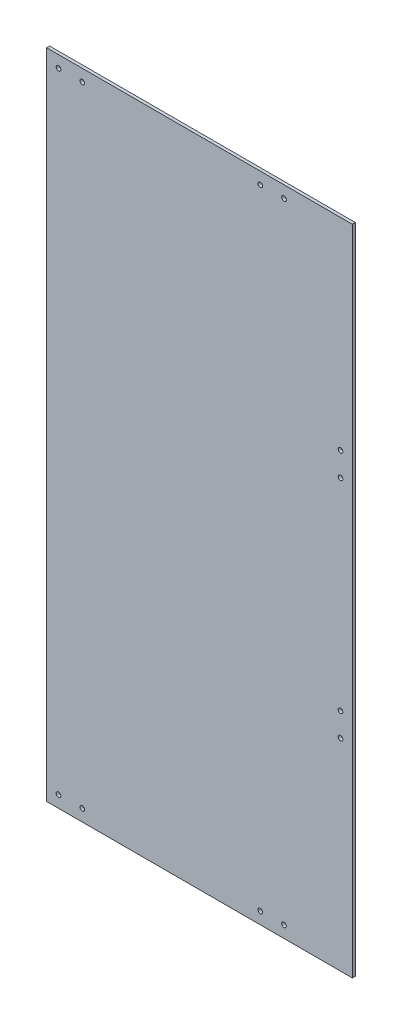
ISO-10303-21;
HEADER;
FILE_DESCRIPTION(('STEP AP214'),'2;1');
FILE_NAME('part.step','',(''),(''),'','','');
FILE_SCHEMA(('AUTOMOTIVE_DESIGN { 1 0 10303 214 1 1 1 1 }'));
ENDSEC;
DATA;
#1=APPLICATION_CONTEXT('core data for automotive mechanical design processes');
#2=APPLICATION_PROTOCOL_DEFINITION('international standard','automotive_design',2000,#1);
#3=PRODUCT_CONTEXT('',#1,'mechanical');
#4=PRODUCT('Part','Part','',(#3));
#5=PRODUCT_RELATED_PRODUCT_CATEGORY('part','',(#4));
#6=PRODUCT_DEFINITION_FORMATION('','',#4);
#7=PRODUCT_DEFINITION_CONTEXT('part definition',#1,'design');
#8=PRODUCT_DEFINITION('design','',#6,#7);
#9=PRODUCT_DEFINITION_SHAPE('','',#8);
#10=(LENGTH_UNIT() NAMED_UNIT(*) SI_UNIT(.MILLI.,.METRE.));
#11=(NAMED_UNIT(*) PLANE_ANGLE_UNIT() SI_UNIT($,.RADIAN.));
#12=(NAMED_UNIT(*) SI_UNIT($,.STERADIAN.) SOLID_ANGLE_UNIT());
#13=UNCERTAINTY_MEASURE_WITH_UNIT(LENGTH_MEASURE(1.E-05),#10,'distance_accuracy_value','');
#14=(GEOMETRIC_REPRESENTATION_CONTEXT(3) GLOBAL_UNCERTAINTY_ASSIGNED_CONTEXT((#13)) GLOBAL_UNIT_ASSIGNED_CONTEXT((#10,
#11,#12)) REPRESENTATION_CONTEXT('',''));
#15=CARTESIAN_POINT('',(0.,0.,0.));
#16=DIRECTION('',(0.,0.,1.));
#17=DIRECTION('',(1.,0.,0.));
#18=AXIS2_PLACEMENT_3D('',#15,#16,#17);
#19=CARTESIAN_POINT('',(0.,0.,0.));
#20=DIRECTION('',(0.,0.,-1.));
#21=DIRECTION('',(-1.,0.,0.));
#22=AXIS2_PLACEMENT_3D('',#19,#20,#21);
#23=PLANE('',#22);
#24=CARTESIAN_POINT('',(150.876,-107.95,0.));
#25=DIRECTION('',(0.,0.,1.));
#26=DIRECTION('',(1.,0.,0.));
#27=AXIS2_PLACEMENT_3D('',#24,#25,#26);
#28=CIRCLE('',#27,2.4892);
#29=CARTESIAN_POINT('',(153.3652,-107.95,0.));
#30=VERTEX_POINT('',#29);
#31=EDGE_CURVE('E143',#30,#30,#28,.T.);
#32=ORIENTED_EDGE('',*,*,#31,.T.);
#33=EDGE_LOOP('',(#32));
#34=FACE_BOUND('',#33,.T.);
#35=CARTESIAN_POINT('',(150.876,-133.35,0.));
#36=DIRECTION('',(0.,0.,1.));
#37=DIRECTION('',(1.,0.,0.));
#38=AXIS2_PLACEMENT_3D('',#35,#36,#37);
#39=CIRCLE('',#38,2.4892);
#40=CARTESIAN_POINT('',(153.3652,-133.35,0.));
#41=VERTEX_POINT('',#40);
#42=EDGE_CURVE('E119',#41,#41,#39,.T.);
#43=ORIENTED_EDGE('',*,*,#42,.T.);
#44=EDGE_LOOP('',(#43));
#45=FACE_BOUND('',#44,.T.);
#46=DIRECTION('',(-1.,0.,0.));
#47=VECTOR('',#46,1.);
#48=CARTESIAN_POINT('',(163.576,349.25,0.));
#49=LINE('',#48,#47);
#50=CARTESIAN_POINT('',(163.576,349.25,0.));
#51=VERTEX_POINT('',#50);
#52=CARTESIAN_POINT('',(-163.576,349.25,0.));
#53=VERTEX_POINT('',#52);
#54=EDGE_CURVE('E115',#51,#53,#49,.T.);
#55=ORIENTED_EDGE('',*,*,#54,.F.);
#56=DIRECTION('',(0.,1.,0.));
#57=VECTOR('',#56,1.);
#58=CARTESIAN_POINT('',(163.576,-349.25,0.));
#59=LINE('',#58,#57);
#60=CARTESIAN_POINT('',(163.576,-349.25,0.));
#61=VERTEX_POINT('',#60);
#62=EDGE_CURVE('E86',#61,#51,#59,.T.);
#63=ORIENTED_EDGE('',*,*,#62,.F.);
#64=DIRECTION('',(1.,0.,0.));
#65=VECTOR('',#64,1.);
#66=CARTESIAN_POINT('',(163.576,-349.25,0.));
#67=LINE('',#66,#65);
#68=CARTESIAN_POINT('',(-163.576,-349.25,0.));
#69=VERTEX_POINT('',#68);
#70=EDGE_CURVE('E80',#69,#61,#67,.T.);
#71=ORIENTED_EDGE('',*,*,#70,.F.);
#72=DIRECTION('',(0.,-1.,0.));
#73=VECTOR('',#72,1.);
#74=CARTESIAN_POINT('',(-163.576,-349.25,0.));
#75=LINE('',#74,#73);
#76=EDGE_CURVE('E104',#53,#69,#75,.T.);
#77=ORIENTED_EDGE('',*,*,#76,.F.);
#78=EDGE_LOOP('',(#55,#63,#71,#77));
#79=FACE_BOUND('',#78,.T.);
#80=CARTESIAN_POINT('',(150.876,107.95,0.));
#81=DIRECTION('',(0.,0.,1.));
#82=DIRECTION('',(1.,0.,0.));
#83=AXIS2_PLACEMENT_3D('',#80,#81,#82);
#84=CIRCLE('',#83,2.4892);
#85=CARTESIAN_POINT('',(153.3652,107.95,0.));
#86=VERTEX_POINT('',#85);
#87=EDGE_CURVE('E151',#86,#86,#84,.T.);
#88=ORIENTED_EDGE('',*,*,#87,.T.);
#89=EDGE_LOOP('',(#88));
#90=FACE_BOUND('',#89,.T.);
#91=CARTESIAN_POINT('',(150.876,133.35,0.));
#92=DIRECTION('',(0.,0.,1.));
#93=DIRECTION('',(1.,0.,0.));
#94=AXIS2_PLACEMENT_3D('',#91,#92,#93);
#95=CIRCLE('',#94,2.4892);
#96=CARTESIAN_POINT('',(153.3652,133.35,0.));
#97=VERTEX_POINT('',#96);
#98=EDGE_CURVE('E159',#97,#97,#95,.T.);
#99=ORIENTED_EDGE('',*,*,#98,.T.);
#100=EDGE_LOOP('',(#99));
#101=FACE_BOUND('',#100,.T.);
#102=CARTESIAN_POINT('',(-150.876,-336.55,0.));
#103=DIRECTION('',(0.,0.,1.));
#104=DIRECTION('',(1.,0.,0.));
#105=AXIS2_PLACEMENT_3D('',#102,#103,#104);
#106=CIRCLE('',#105,2.4892);
#107=CARTESIAN_POINT('',(-148.3868,-336.55,0.));
#108=VERTEX_POINT('',#107);
#109=EDGE_CURVE('E167',#108,#108,#106,.T.);
#110=ORIENTED_EDGE('',*,*,#109,.T.);
#111=EDGE_LOOP('',(#110));
#112=FACE_BOUND('',#111,.T.);
#113=CARTESIAN_POINT('',(-125.476,-336.55,0.));
#114=DIRECTION('',(0.,0.,1.));
#115=DIRECTION('',(1.,0.,0.));
#116=AXIS2_PLACEMENT_3D('',#113,#114,#115);
#117=CIRCLE('',#116,2.4892);
#118=CARTESIAN_POINT('',(-122.9868,-336.55,0.));
#119=VERTEX_POINT('',#118);
#120=EDGE_CURVE('E175',#119,#119,#117,.T.);
#121=ORIENTED_EDGE('',*,*,#120,.T.);
#122=EDGE_LOOP('',(#121));
#123=FACE_BOUND('',#122,.T.);
#124=CARTESIAN_POINT('',(65.024,-336.55,0.));
#125=DIRECTION('',(0.,0.,1.));
#126=DIRECTION('',(1.,0.,0.));
#127=AXIS2_PLACEMENT_3D('',#124,#125,#126);
#128=CIRCLE('',#127,2.4892);
#129=CARTESIAN_POINT('',(67.5132,-336.55,0.));
#130=VERTEX_POINT('',#129);
#131=EDGE_CURVE('E183',#130,#130,#128,.T.);
#132=ORIENTED_EDGE('',*,*,#131,.T.);
#133=EDGE_LOOP('',(#132));
#134=FACE_BOUND('',#133,.T.);
#135=CARTESIAN_POINT('',(90.424,-336.55,0.));
#136=DIRECTION('',(0.,0.,1.));
#137=DIRECTION('',(1.,0.,0.));
#138=AXIS2_PLACEMENT_3D('',#135,#136,#137);
#139=CIRCLE('',#138,2.4892);
#140=CARTESIAN_POINT('',(92.9132,-336.55,0.));
#141=VERTEX_POINT('',#140);
#142=EDGE_CURVE('E191',#141,#141,#139,.T.);
#143=ORIENTED_EDGE('',*,*,#142,.T.);
#144=EDGE_LOOP('',(#143));
#145=FACE_BOUND('',#144,.T.);
#146=CARTESIAN_POINT('',(90.424,336.55,0.));
#147=DIRECTION('',(0.,0.,1.));
#148=DIRECTION('',(1.,0.,0.));
#149=AXIS2_PLACEMENT_3D('',#146,#147,#148);
#150=CIRCLE('',#149,2.4892);
#151=CARTESIAN_POINT('',(92.9132,336.55,0.));
#152=VERTEX_POINT('',#151);
#153=EDGE_CURVE('E199',#152,#152,#150,.T.);
#154=ORIENTED_EDGE('',*,*,#153,.T.);
#155=EDGE_LOOP('',(#154));
#156=FACE_BOUND('',#155,.T.);
#157=CARTESIAN_POINT('',(65.024,336.55,0.));
#158=DIRECTION('',(0.,0.,1.));
#159=DIRECTION('',(1.,0.,0.));
#160=AXIS2_PLACEMENT_3D('',#157,#158,#159);
#161=CIRCLE('',#160,2.4892);
#162=CARTESIAN_POINT('',(67.5132,336.55,0.));
#163=VERTEX_POINT('',#162);
#164=EDGE_CURVE('E207',#163,#163,#161,.T.);
#165=ORIENTED_EDGE('',*,*,#164,.T.);
#166=EDGE_LOOP('',(#165));
#167=FACE_BOUND('',#166,.T.);
#168=CARTESIAN_POINT('',(-125.476,336.55,0.));
#169=DIRECTION('',(0.,0.,1.));
#170=DIRECTION('',(1.,0.,0.));
#171=AXIS2_PLACEMENT_3D('',#168,#169,#170);
#172=CIRCLE('',#171,2.4892);
#173=CARTESIAN_POINT('',(-122.9868,336.55,0.));
#174=VERTEX_POINT('',#173);
#175=EDGE_CURVE('E215',#174,#174,#172,.T.);
#176=ORIENTED_EDGE('',*,*,#175,.T.);
#177=EDGE_LOOP('',(#176));
#178=FACE_BOUND('',#177,.T.);
#179=CARTESIAN_POINT('',(-150.876,336.55,0.));
#180=DIRECTION('',(0.,0.,1.));
#181=DIRECTION('',(1.,0.,0.));
#182=AXIS2_PLACEMENT_3D('',#179,#180,#181);
#183=CIRCLE('',#182,2.4892);
#184=CARTESIAN_POINT('',(-148.3868,336.55,0.));
#185=VERTEX_POINT('',#184);
#186=EDGE_CURVE('E223',#185,#185,#183,.T.);
#187=ORIENTED_EDGE('',*,*,#186,.T.);
#188=EDGE_LOOP('',(#187));
#189=FACE_BOUND('',#188,.T.);
#190=ADVANCED_FACE('F45',(#34,#45,#79,#90,#101,#112,#123,#134,#145,#156,#167,#178,#189),#23,.T.);
#191=CARTESIAN_POINT('',(0.,0.,3.175));
#192=DIRECTION('',(0.,0.,-1.));
#193=DIRECTION('',(-1.,0.,0.));
#194=AXIS2_PLACEMENT_3D('',#191,#192,#193);
#195=PLANE('',#194);
#196=CARTESIAN_POINT('',(-150.876,336.55,3.175));
#197=DIRECTION('',(0.,0.,1.));
#198=DIRECTION('',(1.,0.,0.));
#199=AXIS2_PLACEMENT_3D('',#196,#197,#198);
#200=CIRCLE('',#199,2.4892);
#201=CARTESIAN_POINT('',(-148.3868,336.55,3.175));
#202=VERTEX_POINT('',#201);
#203=EDGE_CURVE('E227',#202,#202,#200,.T.);
#204=ORIENTED_EDGE('',*,*,#203,.F.);
#205=EDGE_LOOP('',(#204));
#206=FACE_BOUND('',#205,.T.);
#207=CARTESIAN_POINT('',(-125.476,336.55,3.175));
#208=DIRECTION('',(0.,0.,1.));
#209=DIRECTION('',(1.,0.,0.));
#210=AXIS2_PLACEMENT_3D('',#207,#208,#209);
#211=CIRCLE('',#210,2.48919999999998);
#212=CARTESIAN_POINT('',(-122.9868,336.55,3.175));
#213=VERTEX_POINT('',#212);
#214=EDGE_CURVE('E219',#213,#213,#211,.T.);
#215=ORIENTED_EDGE('',*,*,#214,.F.);
#216=EDGE_LOOP('',(#215));
#217=FACE_BOUND('',#216,.T.);
#218=CARTESIAN_POINT('',(65.024,336.55,3.175));
#219=DIRECTION('',(0.,0.,1.));
#220=DIRECTION('',(1.,0.,0.));
#221=AXIS2_PLACEMENT_3D('',#218,#219,#220);
#222=CIRCLE('',#221,2.48919999999998);
#223=CARTESIAN_POINT('',(67.5132,336.55,3.175));
#224=VERTEX_POINT('',#223);
#225=EDGE_CURVE('E211',#224,#224,#222,.T.);
#226=ORIENTED_EDGE('',*,*,#225,.F.);
#227=EDGE_LOOP('',(#226));
#228=FACE_BOUND('',#227,.T.);
#229=CARTESIAN_POINT('',(90.424,336.55,3.175));
#230=DIRECTION('',(0.,0.,1.));
#231=DIRECTION('',(1.,0.,0.));
#232=AXIS2_PLACEMENT_3D('',#229,#230,#231);
#233=CIRCLE('',#232,2.48919999999998);
#234=CARTESIAN_POINT('',(92.9132,336.55,3.175));
#235=VERTEX_POINT('',#234);
#236=EDGE_CURVE('E203',#235,#235,#233,.T.);
#237=ORIENTED_EDGE('',*,*,#236,.F.);
#238=EDGE_LOOP('',(#237));
#239=FACE_BOUND('',#238,.T.);
#240=CARTESIAN_POINT('',(90.424,-336.55,3.175));
#241=DIRECTION('',(0.,0.,1.));
#242=DIRECTION('',(1.,0.,0.));
#243=AXIS2_PLACEMENT_3D('',#240,#241,#242);
#244=CIRCLE('',#243,2.48919999999998);
#245=CARTESIAN_POINT('',(92.9132,-336.55,3.175));
#246=VERTEX_POINT('',#245);
#247=EDGE_CURVE('E195',#246,#246,#244,.T.);
#248=ORIENTED_EDGE('',*,*,#247,.F.);
#249=EDGE_LOOP('',(#248));
#250=FACE_BOUND('',#249,.T.);
#251=CARTESIAN_POINT('',(65.024,-336.55,3.175));
#252=DIRECTION('',(0.,0.,1.));
#253=DIRECTION('',(1.,0.,0.));
#254=AXIS2_PLACEMENT_3D('',#251,#252,#253);
#255=CIRCLE('',#254,2.48919999999998);
#256=CARTESIAN_POINT('',(67.5132,-336.55,3.175));
#257=VERTEX_POINT('',#256);
#258=EDGE_CURVE('E187',#257,#257,#255,.T.);
#259=ORIENTED_EDGE('',*,*,#258,.F.);
#260=EDGE_LOOP('',(#259));
#261=FACE_BOUND('',#260,.T.);
#262=CARTESIAN_POINT('',(-125.476,-336.55,3.175));
#263=DIRECTION('',(0.,0.,1.));
#264=DIRECTION('',(1.,0.,0.));
#265=AXIS2_PLACEMENT_3D('',#262,#263,#264);
#266=CIRCLE('',#265,2.48919999999998);
#267=CARTESIAN_POINT('',(-122.9868,-336.55,3.175));
#268=VERTEX_POINT('',#267);
#269=EDGE_CURVE('E179',#268,#268,#266,.T.);
#270=ORIENTED_EDGE('',*,*,#269,.F.);
#271=EDGE_LOOP('',(#270));
#272=FACE_BOUND('',#271,.T.);
#273=CARTESIAN_POINT('',(-150.876,-336.55,3.175));
#274=DIRECTION('',(0.,0.,1.));
#275=DIRECTION('',(1.,0.,0.));
#276=AXIS2_PLACEMENT_3D('',#273,#274,#275);
#277=CIRCLE('',#276,2.4892);
#278=CARTESIAN_POINT('',(-148.3868,-336.55,3.175));
#279=VERTEX_POINT('',#278);
#280=EDGE_CURVE('E171',#279,#279,#277,.T.);
#281=ORIENTED_EDGE('',*,*,#280,.F.);
#282=EDGE_LOOP('',(#281));
#283=FACE_BOUND('',#282,.T.);
#284=CARTESIAN_POINT('',(150.876,107.95,3.175));
#285=DIRECTION('',(0.,0.,1.));
#286=DIRECTION('',(1.,0.,0.));
#287=AXIS2_PLACEMENT_3D('',#284,#285,#286);
#288=CIRCLE('',#287,2.4892);
#289=CARTESIAN_POINT('',(153.3652,107.95,3.175));
#290=VERTEX_POINT('',#289);
#291=EDGE_CURVE('E155',#290,#290,#288,.T.);
#292=ORIENTED_EDGE('',*,*,#291,.F.);
#293=EDGE_LOOP('',(#292));
#294=FACE_BOUND('',#293,.T.);
#295=CARTESIAN_POINT('',(150.876,-107.95,3.175));
#296=DIRECTION('',(0.,0.,1.));
#297=DIRECTION('',(1.,0.,0.));
#298=AXIS2_PLACEMENT_3D('',#295,#296,#297);
#299=CIRCLE('',#298,2.4892);
#300=CARTESIAN_POINT('',(153.3652,-107.95,3.175));
#301=VERTEX_POINT('',#300);
#302=EDGE_CURVE('E147',#301,#301,#299,.T.);
#303=ORIENTED_EDGE('',*,*,#302,.F.);
#304=EDGE_LOOP('',(#303));
#305=FACE_BOUND('',#304,.T.);
#306=CARTESIAN_POINT('',(150.876,-133.35,3.175));
#307=DIRECTION('',(0.,0.,1.));
#308=DIRECTION('',(1.,0.,0.));
#309=AXIS2_PLACEMENT_3D('',#306,#307,#308);
#310=CIRCLE('',#309,2.4892);
#311=CARTESIAN_POINT('',(153.3652,-133.35,3.175));
#312=VERTEX_POINT('',#311);
#313=EDGE_CURVE('E139',#312,#312,#310,.T.);
#314=ORIENTED_EDGE('',*,*,#313,.F.);
#315=EDGE_LOOP('',(#314));
#316=FACE_BOUND('',#315,.T.);
#317=DIRECTION('',(-1.,0.,0.));
#318=VECTOR('',#317,1.);
#319=CARTESIAN_POINT('',(163.576,349.25,3.175));
#320=LINE('',#319,#318);
#321=CARTESIAN_POINT('',(163.576,349.25,3.175));
#322=VERTEX_POINT('',#321);
#323=CARTESIAN_POINT('',(-163.576,349.25,3.175));
#324=VERTEX_POINT('',#323);
#325=EDGE_CURVE('E99',#322,#324,#320,.T.);
#326=ORIENTED_EDGE('',*,*,#325,.T.);
#327=DIRECTION('',(0.,-1.,0.));
#328=VECTOR('',#327,1.);
#329=CARTESIAN_POINT('',(-163.576,-349.25,3.175));
#330=LINE('',#329,#328);
#331=CARTESIAN_POINT('',(-163.576,-349.25,3.175));
#332=VERTEX_POINT('',#331);
#333=EDGE_CURVE('E93',#324,#332,#330,.T.);
#334=ORIENTED_EDGE('',*,*,#333,.T.);
#335=DIRECTION('',(1.,0.,0.));
#336=VECTOR('',#335,1.);
#337=CARTESIAN_POINT('',(163.576,-349.25,3.175));
#338=LINE('',#337,#336);
#339=CARTESIAN_POINT('',(163.576,-349.25,3.175));
#340=VERTEX_POINT('',#339);
#341=EDGE_CURVE('E97',#332,#340,#338,.T.);
#342=ORIENTED_EDGE('',*,*,#341,.T.);
#343=DIRECTION('',(0.,1.,0.));
#344=VECTOR('',#343,1.);
#345=CARTESIAN_POINT('',(163.576,-349.25,3.175));
#346=LINE('',#345,#344);
#347=EDGE_CURVE('E63',#340,#322,#346,.T.);
#348=ORIENTED_EDGE('',*,*,#347,.T.);
#349=EDGE_LOOP('',(#326,#334,#342,#348));
#350=FACE_BOUND('',#349,.T.);
#351=CARTESIAN_POINT('',(150.876,133.35,3.175));
#352=DIRECTION('',(0.,0.,1.));
#353=DIRECTION('',(1.,0.,0.));
#354=AXIS2_PLACEMENT_3D('',#351,#352,#353);
#355=CIRCLE('',#354,2.4892);
#356=CARTESIAN_POINT('',(153.3652,133.35,3.175));
#357=VERTEX_POINT('',#356);
#358=EDGE_CURVE('E163',#357,#357,#355,.T.);
#359=ORIENTED_EDGE('',*,*,#358,.F.);
#360=EDGE_LOOP('',(#359));
#361=FACE_BOUND('',#360,.T.);
#362=ADVANCED_FACE('F94',(#206,#217,#228,#239,#250,#261,#272,#283,#294,#305,#316,#350,#361),
#195,.F.);
#363=CARTESIAN_POINT('',(163.576,349.25,3.175));
#364=DIRECTION('',(0.,-1.,0.));
#365=DIRECTION('',(0.,0.,-1.));
#366=AXIS2_PLACEMENT_3D('',#363,#364,#365);
#367=PLANE('',#366);
#368=ORIENTED_EDGE('',*,*,#54,.T.);
#369=DIRECTION('',(0.,0.,-1.));
#370=VECTOR('',#369,1.);
#371=CARTESIAN_POINT('',(-163.576,349.25,3.175));
#372=LINE('',#371,#370);
#373=EDGE_CURVE('E11',#324,#53,#372,.T.);
#374=ORIENTED_EDGE('',*,*,#373,.F.);
#375=ORIENTED_EDGE('',*,*,#325,.F.);
#376=DIRECTION('',(0.,0.,-1.));
#377=VECTOR('',#376,1.);
#378=CARTESIAN_POINT('',(163.576,349.25,3.175));
#379=LINE('',#378,#377);
#380=EDGE_CURVE('E111',#322,#51,#379,.T.);
#381=ORIENTED_EDGE('',*,*,#380,.T.);
#382=EDGE_LOOP('',(#368,#374,#375,#381));
#383=FACE_BOUND('',#382,.T.);
#384=ADVANCED_FACE('F47',(#383),#367,.F.);
#385=CARTESIAN_POINT('',(-163.576,-349.25,3.175));
#386=DIRECTION('',(1.,0.,0.));
#387=DIRECTION('',(0.,0.,-1.));
#388=AXIS2_PLACEMENT_3D('',#385,#386,#387);
#389=PLANE('',#388);
#390=ORIENTED_EDGE('',*,*,#76,.T.);
#391=DIRECTION('',(0.,0.,-1.));
#392=VECTOR('',#391,1.);
#393=CARTESIAN_POINT('',(-163.576,-349.25,3.175));
#394=LINE('',#393,#392);
#395=EDGE_CURVE('E55',#332,#69,#394,.T.);
#396=ORIENTED_EDGE('',*,*,#395,.F.);
#397=ORIENTED_EDGE('',*,*,#333,.F.);
#398=ORIENTED_EDGE('',*,*,#373,.T.);
#399=EDGE_LOOP('',(#390,#396,#397,#398));
#400=FACE_BOUND('',#399,.T.);
#401=ADVANCED_FACE('F103',(#400),#389,.F.);
#402=CARTESIAN_POINT('',(163.576,-349.25,3.175));
#403=DIRECTION('',(0.,1.,0.));
#404=DIRECTION('',(0.,0.,1.));
#405=AXIS2_PLACEMENT_3D('',#402,#403,#404);
#406=PLANE('',#405);
#407=ORIENTED_EDGE('',*,*,#70,.T.);
#408=DIRECTION('',(0.,0.,-1.));
#409=VECTOR('',#408,1.);
#410=CARTESIAN_POINT('',(163.576,-349.25,3.175));
#411=LINE('',#410,#409);
#412=EDGE_CURVE('E106',#340,#61,#411,.T.);
#413=ORIENTED_EDGE('',*,*,#412,.F.);
#414=ORIENTED_EDGE('',*,*,#341,.F.);
#415=ORIENTED_EDGE('',*,*,#395,.T.);
#416=EDGE_LOOP('',(#407,#413,#414,#415));
#417=FACE_BOUND('',#416,.T.);
#418=ADVANCED_FACE('F107',(#417),#406,.F.);
#419=CARTESIAN_POINT('',(163.576,-349.25,3.175));
#420=DIRECTION('',(-1.,0.,0.));
#421=DIRECTION('',(0.,0.,1.));
#422=AXIS2_PLACEMENT_3D('',#419,#420,#421);
#423=PLANE('',#422);
#424=ORIENTED_EDGE('',*,*,#62,.T.);
#425=ORIENTED_EDGE('',*,*,#380,.F.);
#426=ORIENTED_EDGE('',*,*,#347,.F.);
#427=ORIENTED_EDGE('',*,*,#412,.T.);
#428=EDGE_LOOP('',(#424,#425,#426,#427));
#429=FACE_BOUND('',#428,.T.);
#430=ADVANCED_FACE('F129',(#429),#423,.F.);
#431=CARTESIAN_POINT('',(150.876,-133.35,3.175));
#432=DIRECTION('',(0.,0.,1.));
#433=DIRECTION('',(1.,0.,0.));
#434=AXIS2_PLACEMENT_3D('',#431,#432,#433);
#435=CYLINDRICAL_SURFACE('',#434,2.4892);
#436=ORIENTED_EDGE('',*,*,#42,.F.);
#437=EDGE_LOOP('',(#436));
#438=FACE_BOUND('',#437,.T.);
#439=ORIENTED_EDGE('',*,*,#313,.T.);
#440=EDGE_LOOP('',(#439));
#441=FACE_BOUND('',#440,.T.);
#442=ADVANCED_FACE('F257',(#438,#441),#435,.F.);
#443=CARTESIAN_POINT('',(150.876,-107.95,3.175));
#444=DIRECTION('',(0.,0.,1.));
#445=DIRECTION('',(1.,0.,0.));
#446=AXIS2_PLACEMENT_3D('',#443,#444,#445);
#447=CYLINDRICAL_SURFACE('',#446,2.4892);
#448=ORIENTED_EDGE('',*,*,#31,.F.);
#449=EDGE_LOOP('',(#448));
#450=FACE_BOUND('',#449,.T.);
#451=ORIENTED_EDGE('',*,*,#302,.T.);
#452=EDGE_LOOP('',(#451));
#453=FACE_BOUND('',#452,.T.);
#454=ADVANCED_FACE('F259',(#450,#453),#447,.F.);
#455=CARTESIAN_POINT('',(150.876,107.95,3.175));
#456=DIRECTION('',(0.,0.,1.));
#457=DIRECTION('',(1.,0.,0.));
#458=AXIS2_PLACEMENT_3D('',#455,#456,#457);
#459=CYLINDRICAL_SURFACE('',#458,2.4892);
#460=ORIENTED_EDGE('',*,*,#87,.F.);
#461=EDGE_LOOP('',(#460));
#462=FACE_BOUND('',#461,.T.);
#463=ORIENTED_EDGE('',*,*,#291,.T.);
#464=EDGE_LOOP('',(#463));
#465=FACE_BOUND('',#464,.T.);
#466=ADVANCED_FACE('F265',(#462,#465),#459,.F.);
#467=CARTESIAN_POINT('',(150.876,133.35,3.175));
#468=DIRECTION('',(0.,0.,1.));
#469=DIRECTION('',(1.,0.,0.));
#470=AXIS2_PLACEMENT_3D('',#467,#468,#469);
#471=CYLINDRICAL_SURFACE('',#470,2.4892);
#472=ORIENTED_EDGE('',*,*,#98,.F.);
#473=EDGE_LOOP('',(#472));
#474=FACE_BOUND('',#473,.T.);
#475=ORIENTED_EDGE('',*,*,#358,.T.);
#476=EDGE_LOOP('',(#475));
#477=FACE_BOUND('',#476,.T.);
#478=ADVANCED_FACE('F330',(#474,#477),#471,.F.);
#479=CARTESIAN_POINT('',(-150.876,-336.55,3.175));
#480=DIRECTION('',(0.,0.,1.));
#481=DIRECTION('',(1.,0.,0.));
#482=AXIS2_PLACEMENT_3D('',#479,#480,#481);
#483=CYLINDRICAL_SURFACE('',#482,2.4892);
#484=ORIENTED_EDGE('',*,*,#109,.F.);
#485=EDGE_LOOP('',(#484));
#486=FACE_BOUND('',#485,.T.);
#487=ORIENTED_EDGE('',*,*,#280,.T.);
#488=EDGE_LOOP('',(#487));
#489=FACE_BOUND('',#488,.T.);
#490=ADVANCED_FACE('F340',(#486,#489),#483,.F.);
#491=CARTESIAN_POINT('',(-125.476,-336.55,3.175));
#492=DIRECTION('',(0.,0.,1.));
#493=DIRECTION('',(1.,0.,0.));
#494=AXIS2_PLACEMENT_3D('',#491,#492,#493);
#495=CYLINDRICAL_SURFACE('',#494,2.48919999999999);
#496=ORIENTED_EDGE('',*,*,#120,.F.);
#497=EDGE_LOOP('',(#496));
#498=FACE_BOUND('',#497,.T.);
#499=ORIENTED_EDGE('',*,*,#269,.T.);
#500=EDGE_LOOP('',(#499));
#501=FACE_BOUND('',#500,.T.);
#502=ADVANCED_FACE('F350',(#498,#501),#495,.F.);
#503=CARTESIAN_POINT('',(65.024,-336.55,3.175));
#504=DIRECTION('',(0.,0.,1.));
#505=DIRECTION('',(1.,0.,0.));
#506=AXIS2_PLACEMENT_3D('',#503,#504,#505);
#507=CYLINDRICAL_SURFACE('',#506,2.48919999999999);
#508=ORIENTED_EDGE('',*,*,#131,.F.);
#509=EDGE_LOOP('',(#508));
#510=FACE_BOUND('',#509,.T.);
#511=ORIENTED_EDGE('',*,*,#258,.T.);
#512=EDGE_LOOP('',(#511));
#513=FACE_BOUND('',#512,.T.);
#514=ADVANCED_FACE('F360',(#510,#513),#507,.F.);
#515=CARTESIAN_POINT('',(90.424,-336.55,3.175));
#516=DIRECTION('',(0.,0.,1.));
#517=DIRECTION('',(1.,0.,0.));
#518=AXIS2_PLACEMENT_3D('',#515,#516,#517);
#519=CYLINDRICAL_SURFACE('',#518,2.48919999999999);
#520=ORIENTED_EDGE('',*,*,#142,.F.);
#521=EDGE_LOOP('',(#520));
#522=FACE_BOUND('',#521,.T.);
#523=ORIENTED_EDGE('',*,*,#247,.T.);
#524=EDGE_LOOP('',(#523));
#525=FACE_BOUND('',#524,.T.);
#526=ADVANCED_FACE('F370',(#522,#525),#519,.F.);
#527=CARTESIAN_POINT('',(90.424,336.55,3.175));
#528=DIRECTION('',(0.,0.,1.));
#529=DIRECTION('',(1.,0.,0.));
#530=AXIS2_PLACEMENT_3D('',#527,#528,#529);
#531=CYLINDRICAL_SURFACE('',#530,2.48919999999999);
#532=ORIENTED_EDGE('',*,*,#153,.F.);
#533=EDGE_LOOP('',(#532));
#534=FACE_BOUND('',#533,.T.);
#535=ORIENTED_EDGE('',*,*,#236,.T.);
#536=EDGE_LOOP('',(#535));
#537=FACE_BOUND('',#536,.T.);
#538=ADVANCED_FACE('F380',(#534,#537),#531,.F.);
#539=CARTESIAN_POINT('',(65.024,336.55,3.175));
#540=DIRECTION('',(0.,0.,1.));
#541=DIRECTION('',(1.,0.,0.));
#542=AXIS2_PLACEMENT_3D('',#539,#540,#541);
#543=CYLINDRICAL_SURFACE('',#542,2.48919999999999);
#544=ORIENTED_EDGE('',*,*,#164,.F.);
#545=EDGE_LOOP('',(#544));
#546=FACE_BOUND('',#545,.T.);
#547=ORIENTED_EDGE('',*,*,#225,.T.);
#548=EDGE_LOOP('',(#547));
#549=FACE_BOUND('',#548,.T.);
#550=ADVANCED_FACE('F390',(#546,#549),#543,.F.);
#551=CARTESIAN_POINT('',(-125.476,336.55,3.175));
#552=DIRECTION('',(0.,0.,1.));
#553=DIRECTION('',(1.,0.,0.));
#554=AXIS2_PLACEMENT_3D('',#551,#552,#553);
#555=CYLINDRICAL_SURFACE('',#554,2.48919999999999);
#556=ORIENTED_EDGE('',*,*,#175,.F.);
#557=EDGE_LOOP('',(#556));
#558=FACE_BOUND('',#557,.T.);
#559=ORIENTED_EDGE('',*,*,#214,.T.);
#560=EDGE_LOOP('',(#559));
#561=FACE_BOUND('',#560,.T.);
#562=ADVANCED_FACE('F400',(#558,#561),#555,.F.);
#563=CARTESIAN_POINT('',(-150.876,336.55,3.175));
#564=DIRECTION('',(0.,0.,1.));
#565=DIRECTION('',(1.,0.,0.));
#566=AXIS2_PLACEMENT_3D('',#563,#564,#565);
#567=CYLINDRICAL_SURFACE('',#566,2.4892);
#568=ORIENTED_EDGE('',*,*,#186,.F.);
#569=EDGE_LOOP('',(#568));
#570=FACE_BOUND('',#569,.T.);
#571=ORIENTED_EDGE('',*,*,#203,.T.);
#572=EDGE_LOOP('',(#571));
#573=FACE_BOUND('',#572,.T.);
#574=ADVANCED_FACE('F232',(#570,#573),#567,.F.);
#575=CLOSED_SHELL('',(#190,#362,#384,#401,#418,#430,#442,#454,#466,#478,#490,#502,#514,#526,
#538,#550,#562,#574));
#576=MANIFOLD_SOLID_BREP('B2',#575);
#577=ADVANCED_BREP_SHAPE_REPRESENTATION('',(#18,#576),#14);
#578=SHAPE_DEFINITION_REPRESENTATION(#9,#577);
ENDSEC;
END-ISO-10303-21;
